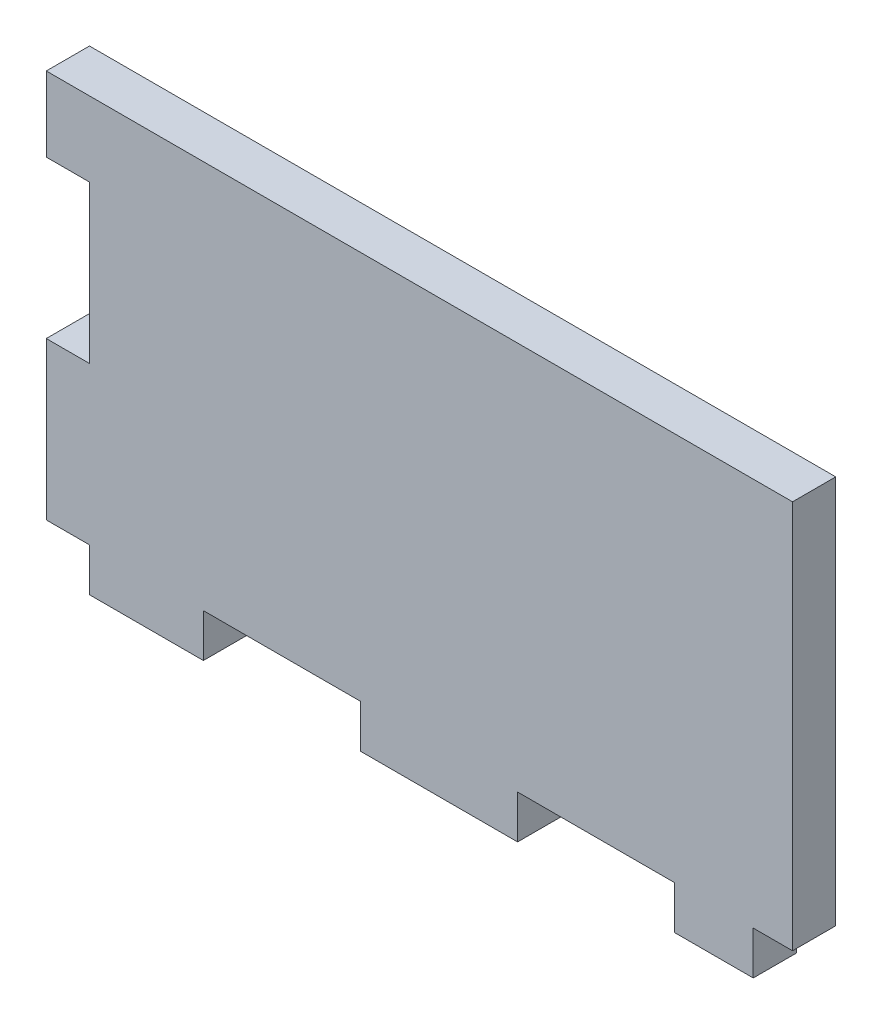
ISO-10303-21;
HEADER;
FILE_DESCRIPTION(('STEP AP214'),'2;1');
FILE_NAME('part.step','',(''),(''),'','','');
FILE_SCHEMA(('AUTOMOTIVE_DESIGN { 1 0 10303 214 1 1 1 1 }'));
ENDSEC;
DATA;
#1=APPLICATION_CONTEXT('core data for automotive mechanical design processes');
#2=APPLICATION_PROTOCOL_DEFINITION('international standard','automotive_design',2000,#1);
#3=PRODUCT_CONTEXT('',#1,'mechanical');
#4=PRODUCT('Part','Part','',(#3));
#5=PRODUCT_RELATED_PRODUCT_CATEGORY('part','',(#4));
#6=PRODUCT_DEFINITION_FORMATION('','',#4);
#7=PRODUCT_DEFINITION_CONTEXT('part definition',#1,'design');
#8=PRODUCT_DEFINITION('design','',#6,#7);
#9=PRODUCT_DEFINITION_SHAPE('','',#8);
#10=(LENGTH_UNIT() NAMED_UNIT(*) SI_UNIT(.MILLI.,.METRE.));
#11=(NAMED_UNIT(*) PLANE_ANGLE_UNIT() SI_UNIT($,.RADIAN.));
#12=(NAMED_UNIT(*) SI_UNIT($,.STERADIAN.) SOLID_ANGLE_UNIT());
#13=UNCERTAINTY_MEASURE_WITH_UNIT(LENGTH_MEASURE(1.E-05),#10,'distance_accuracy_value','');
#14=(GEOMETRIC_REPRESENTATION_CONTEXT(3) GLOBAL_UNCERTAINTY_ASSIGNED_CONTEXT((#13)) GLOBAL_UNIT_ASSIGNED_CONTEXT((#10,
#11,#12)) REPRESENTATION_CONTEXT('',''));
#15=CARTESIAN_POINT('',(0.,0.,0.));
#16=DIRECTION('',(0.,0.,1.));
#17=DIRECTION('',(1.,0.,0.));
#18=AXIS2_PLACEMENT_3D('',#15,#16,#17);
#19=CARTESIAN_POINT('',(47.5,-27.5,5.5));
#20=DIRECTION('',(0.,1.,0.));
#21=DIRECTION('',(-1.,0.,0.));
#22=AXIS2_PLACEMENT_3D('',#19,#20,#21);
#23=PLANE('',#22);
#24=DIRECTION('',(1.,0.,0.));
#25=VECTOR('',#24,1.);
#26=CARTESIAN_POINT('',(47.5,-27.5,0.));
#27=LINE('',#26,#25);
#28=CARTESIAN_POINT('',(-42.,-27.5,0.));
#29=VERTEX_POINT('',#28);
#30=CARTESIAN_POINT('',(-27.5,-27.5,0.));
#31=VERTEX_POINT('',#30);
#32=EDGE_CURVE('E185',#29,#31,#27,.T.);
#33=ORIENTED_EDGE('',*,*,#32,.T.);
#34=DIRECTION('',(0.,0.,1.));
#35=VECTOR('',#34,1.);
#36=CARTESIAN_POINT('',(-27.5,-27.5,0.));
#37=LINE('',#36,#35);
#38=CARTESIAN_POINT('',(-27.5,-27.5,5.5));
#39=VERTEX_POINT('',#38);
#40=EDGE_CURVE('E169',#31,#39,#37,.T.);
#41=ORIENTED_EDGE('',*,*,#40,.T.);
#42=DIRECTION('',(1.,0.,0.));
#43=VECTOR('',#42,1.);
#44=CARTESIAN_POINT('',(47.5,-27.5,5.5));
#45=LINE('',#44,#43);
#46=CARTESIAN_POINT('',(-42.,-27.5,5.5));
#47=VERTEX_POINT('',#46);
#48=EDGE_CURVE('E219',#47,#39,#45,.T.);
#49=ORIENTED_EDGE('',*,*,#48,.F.);
#50=DIRECTION('',(0.,0.,-1.));
#51=VECTOR('',#50,1.);
#52=CARTESIAN_POINT('',(-42.,-27.5,5.5));
#53=LINE('',#52,#51);
#54=EDGE_CURVE('E191',#47,#29,#53,.T.);
#55=ORIENTED_EDGE('',*,*,#54,.T.);
#56=EDGE_LOOP('',(#33,#41,#49,#55));
#57=FACE_BOUND('',#56,.T.);
#58=ADVANCED_FACE('F33',(#57),#23,.F.);
#59=CARTESIAN_POINT('',(-7.49999999999999,-27.5,5.5));
#60=VERTEX_POINT('',#59);
#61=CARTESIAN_POINT('',(12.5,-27.5,5.5));
#62=VERTEX_POINT('',#61);
#63=EDGE_CURVE('E221',#60,#62,#45,.T.);
#64=ORIENTED_EDGE('',*,*,#63,.F.);
#65=DIRECTION('',(0.,0.,1.));
#66=VECTOR('',#65,1.);
#67=CARTESIAN_POINT('',(-7.49999999999999,-27.5,0.));
#68=LINE('',#67,#66);
#69=CARTESIAN_POINT('',(-7.49999999999999,-27.5,0.));
#70=VERTEX_POINT('',#69);
#71=EDGE_CURVE('E179',#70,#60,#68,.T.);
#72=ORIENTED_EDGE('',*,*,#71,.F.);
#73=CARTESIAN_POINT('',(12.5,-27.5,0.));
#74=VERTEX_POINT('',#73);
#75=EDGE_CURVE('E193',#70,#74,#27,.T.);
#76=ORIENTED_EDGE('',*,*,#75,.T.);
#77=DIRECTION('',(0.,0.,1.));
#78=VECTOR('',#77,1.);
#79=CARTESIAN_POINT('',(12.5,-27.5,0.));
#80=LINE('',#79,#78);
#81=EDGE_CURVE('E292',#74,#62,#80,.T.);
#82=ORIENTED_EDGE('',*,*,#81,.T.);
#83=EDGE_LOOP('',(#64,#72,#76,#82));
#84=FACE_BOUND('',#83,.T.);
#85=ADVANCED_FACE('F326',(#84),#23,.F.);
#86=CARTESIAN_POINT('',(-47.5,27.5,5.5));
#87=DIRECTION('',(1.,0.,0.));
#88=DIRECTION('',(0.,0.,-1.));
#89=AXIS2_PLACEMENT_3D('',#86,#87,#88);
#90=PLANE('',#89);
#91=DIRECTION('',(0.,-1.,0.));
#92=VECTOR('',#91,1.);
#93=CARTESIAN_POINT('',(-47.5,27.5,0.));
#94=LINE('',#93,#92);
#95=CARTESIAN_POINT('',(-47.5,27.5,0.));
#96=VERTEX_POINT('',#95);
#97=CARTESIAN_POINT('',(-47.5,18.,0.));
#98=VERTEX_POINT('',#97);
#99=EDGE_CURVE('E201',#96,#98,#94,.T.);
#100=ORIENTED_EDGE('',*,*,#99,.T.);
#101=DIRECTION('',(0.,0.,1.));
#102=VECTOR('',#101,1.);
#103=CARTESIAN_POINT('',(-47.5,18.,0.));
#104=LINE('',#103,#102);
#105=CARTESIAN_POINT('',(-47.5,18.,5.5));
#106=VERTEX_POINT('',#105);
#107=EDGE_CURVE('E229',#98,#106,#104,.T.);
#108=ORIENTED_EDGE('',*,*,#107,.T.);
#109=DIRECTION('',(0.,-1.,0.));
#110=VECTOR('',#109,1.);
#111=CARTESIAN_POINT('',(-47.5,27.5,5.5));
#112=LINE('',#111,#110);
#113=CARTESIAN_POINT('',(-47.5,27.5,5.5));
#114=VERTEX_POINT('',#113);
#115=EDGE_CURVE('E223',#114,#106,#112,.T.);
#116=ORIENTED_EDGE('',*,*,#115,.F.);
#117=DIRECTION('',(0.,0.,-1.));
#118=VECTOR('',#117,1.);
#119=CARTESIAN_POINT('',(-47.5,27.5,5.5));
#120=LINE('',#119,#118);
#121=EDGE_CURVE('E216',#114,#96,#120,.T.);
#122=ORIENTED_EDGE('',*,*,#121,.T.);
#123=EDGE_LOOP('',(#100,#108,#116,#122));
#124=FACE_BOUND('',#123,.T.);
#125=ADVANCED_FACE('F358',(#124),#90,.F.);
#126=CARTESIAN_POINT('',(-47.5,-2.00000000000001,0.));
#127=VERTEX_POINT('',#126);
#128=CARTESIAN_POINT('',(-47.5,-22.,0.));
#129=VERTEX_POINT('',#128);
#130=EDGE_CURVE('E207',#127,#129,#94,.T.);
#131=ORIENTED_EDGE('',*,*,#130,.T.);
#132=DIRECTION('',(0.,0.,1.));
#133=VECTOR('',#132,1.);
#134=CARTESIAN_POINT('',(-47.5,-22.,0.));
#135=LINE('',#134,#133);
#136=CARTESIAN_POINT('',(-47.5,-22.,5.5));
#137=VERTEX_POINT('',#136);
#138=EDGE_CURVE('E228',#129,#137,#135,.T.);
#139=ORIENTED_EDGE('',*,*,#138,.T.);
#140=CARTESIAN_POINT('',(-47.5,-2.00000000000001,5.5));
#141=VERTEX_POINT('',#140);
#142=EDGE_CURVE('E226',#141,#137,#112,.T.);
#143=ORIENTED_EDGE('',*,*,#142,.F.);
#144=DIRECTION('',(0.,0.,1.));
#145=VECTOR('',#144,1.);
#146=CARTESIAN_POINT('',(-47.5,-2.00000000000001,0.));
#147=LINE('',#146,#145);
#148=EDGE_CURVE('E231',#127,#141,#147,.T.);
#149=ORIENTED_EDGE('',*,*,#148,.F.);
#150=EDGE_LOOP('',(#131,#139,#143,#149));
#151=FACE_BOUND('',#150,.T.);
#152=ADVANCED_FACE('F35',(#151),#90,.F.);
#153=CARTESIAN_POINT('',(32.5,-27.5,5.5));
#154=VERTEX_POINT('',#153);
#155=CARTESIAN_POINT('',(42.5,-27.5,5.5));
#156=VERTEX_POINT('',#155);
#157=EDGE_CURVE('E222',#154,#156,#45,.T.);
#158=ORIENTED_EDGE('',*,*,#157,.F.);
#159=DIRECTION('',(0.,0.,1.));
#160=VECTOR('',#159,1.);
#161=CARTESIAN_POINT('',(32.5,-27.5,0.));
#162=LINE('',#161,#160);
#163=CARTESIAN_POINT('',(32.5,-27.5,0.));
#164=VERTEX_POINT('',#163);
#165=EDGE_CURVE('E285',#164,#154,#162,.T.);
#166=ORIENTED_EDGE('',*,*,#165,.F.);
#167=CARTESIAN_POINT('',(42.5,-27.5,0.));
#168=VERTEX_POINT('',#167);
#169=EDGE_CURVE('E195',#164,#168,#27,.T.);
#170=ORIENTED_EDGE('',*,*,#169,.T.);
#171=DIRECTION('',(0.,0.,1.));
#172=VECTOR('',#171,1.);
#173=CARTESIAN_POINT('',(42.5,-27.5,0.));
#174=LINE('',#173,#172);
#175=EDGE_CURVE('E267',#168,#156,#174,.T.);
#176=ORIENTED_EDGE('',*,*,#175,.T.);
#177=EDGE_LOOP('',(#158,#166,#170,#176));
#178=FACE_BOUND('',#177,.T.);
#179=ADVANCED_FACE('F337',(#178),#23,.F.);
#180=CARTESIAN_POINT('',(47.5,27.5,5.5));
#181=DIRECTION('',(-1.,0.,0.));
#182=DIRECTION('',(0.,0.,1.));
#183=AXIS2_PLACEMENT_3D('',#180,#181,#182);
#184=PLANE('',#183);
#185=DIRECTION('',(0.,1.,0.));
#186=VECTOR('',#185,1.);
#187=CARTESIAN_POINT('',(47.5,27.5,5.5));
#188=LINE('',#187,#186);
#189=CARTESIAN_POINT('',(47.5,-21.9959018670013,5.5));
#190=VERTEX_POINT('',#189);
#191=CARTESIAN_POINT('',(47.5,27.5,5.5));
#192=VERTEX_POINT('',#191);
#193=EDGE_CURVE('E217',#190,#192,#188,.T.);
#194=ORIENTED_EDGE('',*,*,#193,.F.);
#195=DIRECTION('',(0.,0.,1.));
#196=VECTOR('',#195,1.);
#197=CARTESIAN_POINT('',(47.5,-21.9959018670013,0.));
#198=LINE('',#197,#196);
#199=CARTESIAN_POINT('',(47.5,-21.9959018670013,0.));
#200=VERTEX_POINT('',#199);
#201=EDGE_CURVE('E269',#200,#190,#198,.T.);
#202=ORIENTED_EDGE('',*,*,#201,.F.);
#203=DIRECTION('',(0.,1.,0.));
#204=VECTOR('',#203,1.);
#205=CARTESIAN_POINT('',(47.5,27.5,0.));
#206=LINE('',#205,#204);
#207=CARTESIAN_POINT('',(47.5,27.5,0.));
#208=VERTEX_POINT('',#207);
#209=EDGE_CURVE('E192',#200,#208,#206,.T.);
#210=ORIENTED_EDGE('',*,*,#209,.T.);
#211=DIRECTION('',(0.,0.,-1.));
#212=VECTOR('',#211,1.);
#213=CARTESIAN_POINT('',(47.5,27.5,5.5));
#214=LINE('',#213,#212);
#215=EDGE_CURVE('E41',#192,#208,#214,.T.);
#216=ORIENTED_EDGE('',*,*,#215,.F.);
#217=EDGE_LOOP('',(#194,#202,#210,#216));
#218=FACE_BOUND('',#217,.T.);
#219=ADVANCED_FACE('F348',(#218),#184,.F.);
#220=CARTESIAN_POINT('',(47.5,27.5,5.5));
#221=DIRECTION('',(0.,-1.,0.));
#222=DIRECTION('',(1.,0.,0.));
#223=AXIS2_PLACEMENT_3D('',#220,#221,#222);
#224=PLANE('',#223);
#225=DIRECTION('',(-1.,0.,0.));
#226=VECTOR('',#225,1.);
#227=CARTESIAN_POINT('',(47.5,27.5,0.));
#228=LINE('',#227,#226);
#229=EDGE_CURVE('E196',#208,#96,#228,.T.);
#230=ORIENTED_EDGE('',*,*,#229,.T.);
#231=ORIENTED_EDGE('',*,*,#121,.F.);
#232=DIRECTION('',(-1.,0.,0.));
#233=VECTOR('',#232,1.);
#234=CARTESIAN_POINT('',(47.5,27.5,5.5));
#235=LINE('',#234,#233);
#236=EDGE_CURVE('E214',#192,#114,#235,.T.);
#237=ORIENTED_EDGE('',*,*,#236,.F.);
#238=ORIENTED_EDGE('',*,*,#215,.T.);
#239=EDGE_LOOP('',(#230,#231,#237,#238));
#240=FACE_BOUND('',#239,.T.);
#241=ADVANCED_FACE('F356',(#240),#224,.F.);
#242=CARTESIAN_POINT('',(0.,0.,5.5));
#243=DIRECTION('',(0.,0.,-1.));
#244=DIRECTION('',(-1.,0.,0.));
#245=AXIS2_PLACEMENT_3D('',#242,#243,#244);
#246=PLANE('',#245);
#247=ORIENTED_EDGE('',*,*,#48,.T.);
#248=DIRECTION('',(0.,-1.,0.));
#249=VECTOR('',#248,1.);
#250=CARTESIAN_POINT('',(-27.5,-27.5,5.5));
#251=LINE('',#250,#249);
#252=CARTESIAN_POINT('',(-27.5,-21.9959018670013,5.5));
#253=VERTEX_POINT('',#252);
#254=EDGE_CURVE('E174',#253,#39,#251,.T.);
#255=ORIENTED_EDGE('',*,*,#254,.F.);
#256=DIRECTION('',(-1.,0.,0.));
#257=VECTOR('',#256,1.);
#258=CARTESIAN_POINT('',(-27.5,-21.9959018670013,5.5));
#259=LINE('',#258,#257);
#260=CARTESIAN_POINT('',(-7.49999999999999,-21.9959018670013,5.5));
#261=VERTEX_POINT('',#260);
#262=EDGE_CURVE('E188',#261,#253,#259,.T.);
#263=ORIENTED_EDGE('',*,*,#262,.F.);
#264=DIRECTION('',(0.,1.,0.));
#265=VECTOR('',#264,1.);
#266=CARTESIAN_POINT('',(-7.49999999999999,-27.5,5.5));
#267=LINE('',#266,#265);
#268=EDGE_CURVE('E314',#60,#261,#267,.T.);
#269=ORIENTED_EDGE('',*,*,#268,.F.);
#270=ORIENTED_EDGE('',*,*,#63,.T.);
#271=DIRECTION('',(0.,-1.,0.));
#272=VECTOR('',#271,1.);
#273=CARTESIAN_POINT('',(12.5,-27.5,5.5));
#274=LINE('',#273,#272);
#275=CARTESIAN_POINT('',(12.5,-21.9959018670013,5.5));
#276=VERTEX_POINT('',#275);
#277=EDGE_CURVE('E295',#276,#62,#274,.T.);
#278=ORIENTED_EDGE('',*,*,#277,.F.);
#279=DIRECTION('',(-1.,0.,0.));
#280=VECTOR('',#279,1.);
#281=CARTESIAN_POINT('',(12.5,-21.9959018670013,5.5));
#282=LINE('',#281,#280);
#283=CARTESIAN_POINT('',(32.5,-21.9959018670013,5.5));
#284=VERTEX_POINT('',#283);
#285=EDGE_CURVE('E298',#284,#276,#282,.T.);
#286=ORIENTED_EDGE('',*,*,#285,.F.);
#287=DIRECTION('',(0.,1.,0.));
#288=VECTOR('',#287,1.);
#289=CARTESIAN_POINT('',(32.5,-27.5,5.5));
#290=LINE('',#289,#288);
#291=EDGE_CURVE('E274',#154,#284,#290,.T.);
#292=ORIENTED_EDGE('',*,*,#291,.F.);
#293=ORIENTED_EDGE('',*,*,#157,.T.);
#294=DIRECTION('',(0.,-1.,0.));
#295=VECTOR('',#294,1.);
#296=CARTESIAN_POINT('',(42.5,-27.5,5.5));
#297=LINE('',#296,#295);
#298=CARTESIAN_POINT('',(42.5,-21.9959018670013,5.5));
#299=VERTEX_POINT('',#298);
#300=EDGE_CURVE('E279',#299,#156,#297,.T.);
#301=ORIENTED_EDGE('',*,*,#300,.F.);
#302=DIRECTION('',(-1.,0.,0.));
#303=VECTOR('',#302,1.);
#304=CARTESIAN_POINT('',(42.5,-21.9959018670013,5.5));
#305=LINE('',#304,#303);
#306=EDGE_CURVE('E275',#190,#299,#305,.T.);
#307=ORIENTED_EDGE('',*,*,#306,.F.);
#308=ORIENTED_EDGE('',*,*,#193,.T.);
#309=ORIENTED_EDGE('',*,*,#236,.T.);
#310=ORIENTED_EDGE('',*,*,#115,.T.);
#311=DIRECTION('',(-1.,0.,0.));
#312=VECTOR('',#311,1.);
#313=CARTESIAN_POINT('',(-47.5,18.,5.5));
#314=LINE('',#313,#312);
#315=CARTESIAN_POINT('',(-42.,18.,5.5));
#316=VERTEX_POINT('',#315);
#317=EDGE_CURVE('E246',#316,#106,#314,.T.);
#318=ORIENTED_EDGE('',*,*,#317,.F.);
#319=DIRECTION('',(0.,1.,0.));
#320=VECTOR('',#319,1.);
#321=CARTESIAN_POINT('',(-42.,18.,5.5));
#322=LINE('',#321,#320);
#323=CARTESIAN_POINT('',(-42.,-2.00000000000001,5.5));
#324=VERTEX_POINT('',#323);
#325=EDGE_CURVE('E239',#324,#316,#322,.T.);
#326=ORIENTED_EDGE('',*,*,#325,.F.);
#327=DIRECTION('',(1.,0.,0.));
#328=VECTOR('',#327,1.);
#329=CARTESIAN_POINT('',(-47.5,-2.00000000000001,5.5));
#330=LINE('',#329,#328);
#331=EDGE_CURVE('E243',#141,#324,#330,.T.);
#332=ORIENTED_EDGE('',*,*,#331,.F.);
#333=ORIENTED_EDGE('',*,*,#142,.T.);
#334=DIRECTION('',(-1.,0.,0.));
#335=VECTOR('',#334,1.);
#336=CARTESIAN_POINT('',(-47.5,-22.,5.5));
#337=LINE('',#336,#335);
#338=CARTESIAN_POINT('',(-42.,-22.,5.5));
#339=VERTEX_POINT('',#338);
#340=EDGE_CURVE('E262',#339,#137,#337,.T.);
#341=ORIENTED_EDGE('',*,*,#340,.F.);
#342=DIRECTION('',(0.,1.,0.));
#343=VECTOR('',#342,1.);
#344=CARTESIAN_POINT('',(-42.,-22.,5.5));
#345=LINE('',#344,#343);
#346=EDGE_CURVE('E238',#47,#339,#345,.T.);
#347=ORIENTED_EDGE('',*,*,#346,.F.);
#348=EDGE_LOOP('',(#247,#255,#263,#269,#270,#278,#286,#292,#293,#301,#307,#308,#309,#310,#318,
#326,#332,#333,#341,#347));
#349=FACE_BOUND('',#348,.T.);
#350=ADVANCED_FACE('F334',(#349),#246,.F.);
#351=CARTESIAN_POINT('',(0.,0.,0.));
#352=DIRECTION('',(0.,0.,-1.));
#353=DIRECTION('',(-1.,0.,0.));
#354=AXIS2_PLACEMENT_3D('',#351,#352,#353);
#355=PLANE('',#354);
#356=DIRECTION('',(0.,-1.,0.));
#357=VECTOR('',#356,1.);
#358=CARTESIAN_POINT('',(-27.5,-27.5,0.));
#359=LINE('',#358,#357);
#360=CARTESIAN_POINT('',(-27.5,-21.9959018670013,0.));
#361=VERTEX_POINT('',#360);
#362=EDGE_CURVE('E172',#361,#31,#359,.T.);
#363=ORIENTED_EDGE('',*,*,#362,.T.);
#364=ORIENTED_EDGE('',*,*,#32,.F.);
#365=DIRECTION('',(0.,-1.,0.));
#366=VECTOR('',#365,1.);
#367=CARTESIAN_POINT('',(-42.,0.,0.));
#368=LINE('',#367,#366);
#369=CARTESIAN_POINT('',(-42.,-22.,0.));
#370=VERTEX_POINT('',#369);
#371=EDGE_CURVE('E11',#370,#29,#368,.T.);
#372=ORIENTED_EDGE('',*,*,#371,.F.);
#373=DIRECTION('',(-1.,0.,0.));
#374=VECTOR('',#373,1.);
#375=CARTESIAN_POINT('',(-47.5,-22.,0.));
#376=LINE('',#375,#374);
#377=EDGE_CURVE('E259',#370,#129,#376,.T.);
#378=ORIENTED_EDGE('',*,*,#377,.T.);
#379=ORIENTED_EDGE('',*,*,#130,.F.);
#380=DIRECTION('',(1.,0.,0.));
#381=VECTOR('',#380,1.);
#382=CARTESIAN_POINT('',(-47.5,-2.00000000000001,0.));
#383=LINE('',#382,#381);
#384=CARTESIAN_POINT('',(-42.,-2.00000000000001,0.));
#385=VERTEX_POINT('',#384);
#386=EDGE_CURVE('E251',#127,#385,#383,.T.);
#387=ORIENTED_EDGE('',*,*,#386,.T.);
#388=DIRECTION('',(0.,1.,0.));
#389=VECTOR('',#388,1.);
#390=CARTESIAN_POINT('',(-42.,18.,0.));
#391=LINE('',#390,#389);
#392=CARTESIAN_POINT('',(-42.,18.,0.));
#393=VERTEX_POINT('',#392);
#394=EDGE_CURVE('E232',#385,#393,#391,.T.);
#395=ORIENTED_EDGE('',*,*,#394,.T.);
#396=DIRECTION('',(-1.,0.,0.));
#397=VECTOR('',#396,1.);
#398=CARTESIAN_POINT('',(-47.5,18.,0.));
#399=LINE('',#398,#397);
#400=EDGE_CURVE('E242',#393,#98,#399,.T.);
#401=ORIENTED_EDGE('',*,*,#400,.T.);
#402=ORIENTED_EDGE('',*,*,#99,.F.);
#403=ORIENTED_EDGE('',*,*,#229,.F.);
#404=ORIENTED_EDGE('',*,*,#209,.F.);
#405=DIRECTION('',(-1.,0.,0.));
#406=VECTOR('',#405,1.);
#407=CARTESIAN_POINT('',(42.5,-21.9959018670013,0.));
#408=LINE('',#407,#406);
#409=CARTESIAN_POINT('',(42.5,-21.9959018670013,0.));
#410=VERTEX_POINT('',#409);
#411=EDGE_CURVE('E270',#200,#410,#408,.T.);
#412=ORIENTED_EDGE('',*,*,#411,.T.);
#413=DIRECTION('',(0.,-1.,0.));
#414=VECTOR('',#413,1.);
#415=CARTESIAN_POINT('',(42.5,-27.5,0.));
#416=LINE('',#415,#414);
#417=EDGE_CURVE('E278',#410,#168,#416,.T.);
#418=ORIENTED_EDGE('',*,*,#417,.T.);
#419=ORIENTED_EDGE('',*,*,#169,.F.);
#420=DIRECTION('',(0.,1.,0.));
#421=VECTOR('',#420,1.);
#422=CARTESIAN_POINT('',(32.5,-27.5,0.));
#423=LINE('',#422,#421);
#424=CARTESIAN_POINT('',(32.5,-21.9959018670013,0.));
#425=VERTEX_POINT('',#424);
#426=EDGE_CURVE('E297',#164,#425,#423,.T.);
#427=ORIENTED_EDGE('',*,*,#426,.T.);
#428=DIRECTION('',(-1.,0.,0.));
#429=VECTOR('',#428,1.);
#430=CARTESIAN_POINT('',(12.5,-21.9959018670013,0.));
#431=LINE('',#430,#429);
#432=CARTESIAN_POINT('',(12.5,-21.9959018670013,0.));
#433=VERTEX_POINT('',#432);
#434=EDGE_CURVE('E56',#425,#433,#431,.T.);
#435=ORIENTED_EDGE('',*,*,#434,.T.);
#436=DIRECTION('',(0.,-1.,0.));
#437=VECTOR('',#436,1.);
#438=CARTESIAN_POINT('',(12.5,-27.5,0.));
#439=LINE('',#438,#437);
#440=EDGE_CURVE('E288',#433,#74,#439,.T.);
#441=ORIENTED_EDGE('',*,*,#440,.T.);
#442=ORIENTED_EDGE('',*,*,#75,.F.);
#443=DIRECTION('',(0.,1.,0.));
#444=VECTOR('',#443,1.);
#445=CARTESIAN_POINT('',(-7.49999999999999,-27.5,0.));
#446=LINE('',#445,#444);
#447=CARTESIAN_POINT('',(-7.49999999999999,-21.9959018670013,0.));
#448=VERTEX_POINT('',#447);
#449=EDGE_CURVE('E187',#70,#448,#446,.T.);
#450=ORIENTED_EDGE('',*,*,#449,.T.);
#451=DIRECTION('',(-1.,0.,0.));
#452=VECTOR('',#451,1.);
#453=CARTESIAN_POINT('',(-27.5,-21.9959018670013,0.));
#454=LINE('',#453,#452);
#455=EDGE_CURVE('E48',#448,#361,#454,.T.);
#456=ORIENTED_EDGE('',*,*,#455,.T.);
#457=EDGE_LOOP('',(#363,#364,#372,#378,#379,#387,#395,#401,#402,#403,#404,#412,#418,#419,#427,
#435,#441,#442,#450,#456));
#458=FACE_BOUND('',#457,.T.);
#459=ADVANCED_FACE('F183',(#458),#355,.T.);
#460=CARTESIAN_POINT('',(-47.5,18.,0.));
#461=DIRECTION('',(0.,1.,0.));
#462=DIRECTION('',(0.,0.,1.));
#463=AXIS2_PLACEMENT_3D('',#460,#461,#462);
#464=PLANE('',#463);
#465=ORIENTED_EDGE('',*,*,#317,.T.);
#466=ORIENTED_EDGE('',*,*,#107,.F.);
#467=ORIENTED_EDGE('',*,*,#400,.F.);
#468=DIRECTION('',(0.,0.,1.));
#469=VECTOR('',#468,1.);
#470=CARTESIAN_POINT('',(-42.,18.,0.));
#471=LINE('',#470,#469);
#472=EDGE_CURVE('E236',#393,#316,#471,.T.);
#473=ORIENTED_EDGE('',*,*,#472,.T.);
#474=EDGE_LOOP('',(#465,#466,#467,#473));
#475=FACE_BOUND('',#474,.T.);
#476=ADVANCED_FACE('F361',(#475),#464,.F.);
#477=CARTESIAN_POINT('',(-42.,18.,0.));
#478=DIRECTION('',(1.,0.,0.));
#479=DIRECTION('',(0.,0.,-1.));
#480=AXIS2_PLACEMENT_3D('',#477,#478,#479);
#481=PLANE('',#480);
#482=ORIENTED_EDGE('',*,*,#325,.T.);
#483=ORIENTED_EDGE('',*,*,#472,.F.);
#484=ORIENTED_EDGE('',*,*,#394,.F.);
#485=DIRECTION('',(0.,0.,1.));
#486=VECTOR('',#485,1.);
#487=CARTESIAN_POINT('',(-42.,-2.00000000000001,0.));
#488=LINE('',#487,#486);
#489=EDGE_CURVE('E234',#385,#324,#488,.T.);
#490=ORIENTED_EDGE('',*,*,#489,.T.);
#491=EDGE_LOOP('',(#482,#483,#484,#490));
#492=FACE_BOUND('',#491,.T.);
#493=ADVANCED_FACE('F365',(#492),#481,.F.);
#494=CARTESIAN_POINT('',(-47.5,-2.00000000000001,0.));
#495=DIRECTION('',(0.,-1.,0.));
#496=DIRECTION('',(0.,0.,-1.));
#497=AXIS2_PLACEMENT_3D('',#494,#495,#496);
#498=PLANE('',#497);
#499=ORIENTED_EDGE('',*,*,#331,.T.);
#500=ORIENTED_EDGE('',*,*,#489,.F.);
#501=ORIENTED_EDGE('',*,*,#386,.F.);
#502=ORIENTED_EDGE('',*,*,#148,.T.);
#503=EDGE_LOOP('',(#499,#500,#501,#502));
#504=FACE_BOUND('',#503,.T.);
#505=ADVANCED_FACE('F367',(#504),#498,.F.);
#506=CARTESIAN_POINT('',(-42.,-22.,0.));
#507=DIRECTION('',(1.,0.,0.));
#508=DIRECTION('',(0.,0.,-1.));
#509=AXIS2_PLACEMENT_3D('',#506,#507,#508);
#510=PLANE('',#509);
#511=ORIENTED_EDGE('',*,*,#346,.T.);
#512=DIRECTION('',(0.,0.,1.));
#513=VECTOR('',#512,1.);
#514=CARTESIAN_POINT('',(-42.,-22.,0.));
#515=LINE('',#514,#513);
#516=EDGE_CURVE('E256',#370,#339,#515,.T.);
#517=ORIENTED_EDGE('',*,*,#516,.F.);
#518=ORIENTED_EDGE('',*,*,#371,.T.);
#519=ORIENTED_EDGE('',*,*,#54,.F.);
#520=EDGE_LOOP('',(#511,#517,#518,#519));
#521=FACE_BOUND('',#520,.T.);
#522=ADVANCED_FACE('F380',(#521),#510,.F.);
#523=CARTESIAN_POINT('',(-47.5,-22.,0.));
#524=DIRECTION('',(0.,1.,0.));
#525=DIRECTION('',(0.,0.,1.));
#526=AXIS2_PLACEMENT_3D('',#523,#524,#525);
#527=PLANE('',#526);
#528=ORIENTED_EDGE('',*,*,#340,.T.);
#529=ORIENTED_EDGE('',*,*,#138,.F.);
#530=ORIENTED_EDGE('',*,*,#377,.F.);
#531=ORIENTED_EDGE('',*,*,#516,.T.);
#532=EDGE_LOOP('',(#528,#529,#530,#531));
#533=FACE_BOUND('',#532,.T.);
#534=ADVANCED_FACE('F377',(#533),#527,.F.);
#535=CARTESIAN_POINT('',(42.5,-27.5,0.));
#536=DIRECTION('',(-1.,0.,0.));
#537=DIRECTION('',(0.,0.,1.));
#538=AXIS2_PLACEMENT_3D('',#535,#536,#537);
#539=PLANE('',#538);
#540=ORIENTED_EDGE('',*,*,#300,.T.);
#541=ORIENTED_EDGE('',*,*,#175,.F.);
#542=ORIENTED_EDGE('',*,*,#417,.F.);
#543=DIRECTION('',(0.,0.,1.));
#544=VECTOR('',#543,1.);
#545=CARTESIAN_POINT('',(42.5,-21.9959018670013,0.));
#546=LINE('',#545,#544);
#547=EDGE_CURVE('E272',#410,#299,#546,.T.);
#548=ORIENTED_EDGE('',*,*,#547,.T.);
#549=EDGE_LOOP('',(#540,#541,#542,#548));
#550=FACE_BOUND('',#549,.T.);
#551=ADVANCED_FACE('F339',(#550),#539,.F.);
#552=CARTESIAN_POINT('',(42.5,-21.9959018670013,0.));
#553=DIRECTION('',(0.,1.,0.));
#554=DIRECTION('',(0.,0.,1.));
#555=AXIS2_PLACEMENT_3D('',#552,#553,#554);
#556=PLANE('',#555);
#557=ORIENTED_EDGE('',*,*,#306,.T.);
#558=ORIENTED_EDGE('',*,*,#547,.F.);
#559=ORIENTED_EDGE('',*,*,#411,.F.);
#560=ORIENTED_EDGE('',*,*,#201,.T.);
#561=EDGE_LOOP('',(#557,#558,#559,#560));
#562=FACE_BOUND('',#561,.T.);
#563=ADVANCED_FACE('F345',(#562),#556,.F.);
#564=CARTESIAN_POINT('',(12.5,-27.5,0.));
#565=DIRECTION('',(-1.,0.,0.));
#566=DIRECTION('',(0.,0.,1.));
#567=AXIS2_PLACEMENT_3D('',#564,#565,#566);
#568=PLANE('',#567);
#569=ORIENTED_EDGE('',*,*,#277,.T.);
#570=ORIENTED_EDGE('',*,*,#81,.F.);
#571=ORIENTED_EDGE('',*,*,#440,.F.);
#572=DIRECTION('',(0.,0.,1.));
#573=VECTOR('',#572,1.);
#574=CARTESIAN_POINT('',(12.5,-21.9959018670013,0.));
#575=LINE('',#574,#573);
#576=EDGE_CURVE('E290',#433,#276,#575,.T.);
#577=ORIENTED_EDGE('',*,*,#576,.T.);
#578=EDGE_LOOP('',(#569,#570,#571,#577));
#579=FACE_BOUND('',#578,.T.);
#580=ADVANCED_FACE('F483',(#579),#568,.F.);
#581=CARTESIAN_POINT('',(12.5,-21.9959018670013,0.));
#582=DIRECTION('',(0.,1.,0.));
#583=DIRECTION('',(0.,0.,1.));
#584=AXIS2_PLACEMENT_3D('',#581,#582,#583);
#585=PLANE('',#584);
#586=ORIENTED_EDGE('',*,*,#285,.T.);
#587=ORIENTED_EDGE('',*,*,#576,.F.);
#588=ORIENTED_EDGE('',*,*,#434,.F.);
#589=DIRECTION('',(0.,0.,1.));
#590=VECTOR('',#589,1.);
#591=CARTESIAN_POINT('',(32.5,-21.9959018670013,0.));
#592=LINE('',#591,#590);
#593=EDGE_CURVE('E287',#425,#284,#592,.T.);
#594=ORIENTED_EDGE('',*,*,#593,.T.);
#595=EDGE_LOOP('',(#586,#587,#588,#594));
#596=FACE_BOUND('',#595,.T.);
#597=ADVANCED_FACE('F490',(#596),#585,.F.);
#598=CARTESIAN_POINT('',(32.5,-27.5,0.));
#599=DIRECTION('',(1.,0.,0.));
#600=DIRECTION('',(0.,0.,-1.));
#601=AXIS2_PLACEMENT_3D('',#598,#599,#600);
#602=PLANE('',#601);
#603=ORIENTED_EDGE('',*,*,#291,.T.);
#604=ORIENTED_EDGE('',*,*,#593,.F.);
#605=ORIENTED_EDGE('',*,*,#426,.F.);
#606=ORIENTED_EDGE('',*,*,#165,.T.);
#607=EDGE_LOOP('',(#603,#604,#605,#606));
#608=FACE_BOUND('',#607,.T.);
#609=ADVANCED_FACE('F391',(#608),#602,.F.);
#610=CARTESIAN_POINT('',(-27.5,-27.5,0.));
#611=DIRECTION('',(-1.,0.,0.));
#612=DIRECTION('',(0.,0.,1.));
#613=AXIS2_PLACEMENT_3D('',#610,#611,#612);
#614=PLANE('',#613);
#615=ORIENTED_EDGE('',*,*,#254,.T.);
#616=ORIENTED_EDGE('',*,*,#40,.F.);
#617=ORIENTED_EDGE('',*,*,#362,.F.);
#618=DIRECTION('',(0.,0.,1.));
#619=VECTOR('',#618,1.);
#620=CARTESIAN_POINT('',(-27.5,-21.9959018670013,0.));
#621=LINE('',#620,#619);
#622=EDGE_CURVE('E248',#361,#253,#621,.T.);
#623=ORIENTED_EDGE('',*,*,#622,.T.);
#624=EDGE_LOOP('',(#615,#616,#617,#623));
#625=FACE_BOUND('',#624,.T.);
#626=ADVANCED_FACE('F171',(#625),#614,.F.);
#627=CARTESIAN_POINT('',(-27.5,-21.9959018670013,0.));
#628=DIRECTION('',(0.,1.,0.));
#629=DIRECTION('',(0.,0.,1.));
#630=AXIS2_PLACEMENT_3D('',#627,#628,#629);
#631=PLANE('',#630);
#632=ORIENTED_EDGE('',*,*,#262,.T.);
#633=ORIENTED_EDGE('',*,*,#622,.F.);
#634=ORIENTED_EDGE('',*,*,#455,.F.);
#635=DIRECTION('',(0.,0.,1.));
#636=VECTOR('',#635,1.);
#637=CARTESIAN_POINT('',(-7.49999999999999,-21.9959018670013,0.));
#638=LINE('',#637,#636);
#639=EDGE_CURVE('E309',#448,#261,#638,.T.);
#640=ORIENTED_EDGE('',*,*,#639,.T.);
#641=EDGE_LOOP('',(#632,#633,#634,#640));
#642=FACE_BOUND('',#641,.T.);
#643=ADVANCED_FACE('F383',(#642),#631,.F.);
#644=CARTESIAN_POINT('',(-7.49999999999999,-27.5,0.));
#645=DIRECTION('',(1.,0.,0.));
#646=DIRECTION('',(0.,0.,-1.));
#647=AXIS2_PLACEMENT_3D('',#644,#645,#646);
#648=PLANE('',#647);
#649=ORIENTED_EDGE('',*,*,#268,.T.);
#650=ORIENTED_EDGE('',*,*,#639,.F.);
#651=ORIENTED_EDGE('',*,*,#449,.F.);
#652=ORIENTED_EDGE('',*,*,#71,.T.);
#653=EDGE_LOOP('',(#649,#650,#651,#652));
#654=FACE_BOUND('',#653,.T.);
#655=ADVANCED_FACE('F322',(#654),#648,.F.);
#656=CLOSED_SHELL('',(#58,#85,#125,#152,#179,#219,#241,#350,#459,#476,#493,#505,#522,#534,#551,
#563,#580,#597,#609,#626,#643,#655));
#657=MANIFOLD_SOLID_BREP('B2',#656);
#658=ADVANCED_BREP_SHAPE_REPRESENTATION('',(#18,#657),#14);
#659=SHAPE_DEFINITION_REPRESENTATION(#9,#658);
ENDSEC;
END-ISO-10303-21;
